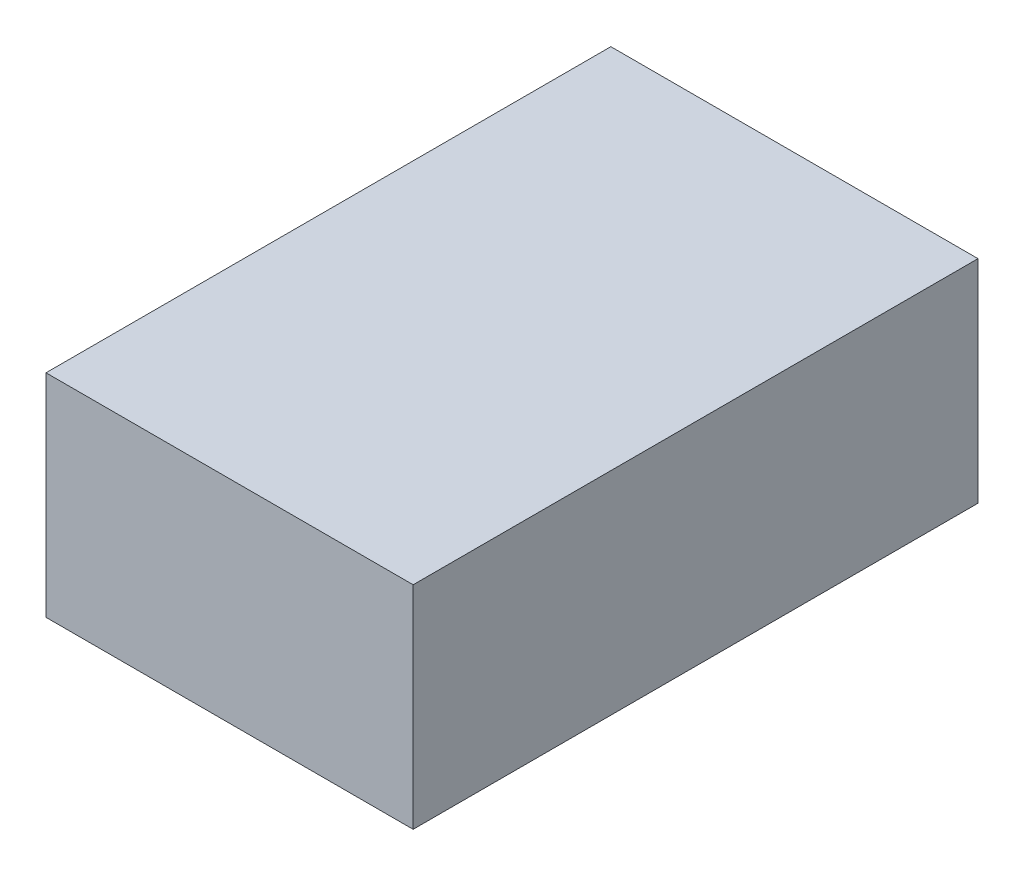
ISO-10303-21;
HEADER;
FILE_DESCRIPTION(('STEP AP214'),'2;1');
FILE_NAME('part.step','',(''),(''),'','','');
FILE_SCHEMA(('AUTOMOTIVE_DESIGN { 1 0 10303 214 1 1 1 1 }'));
ENDSEC;
DATA;
#1=APPLICATION_CONTEXT('core data for automotive mechanical design processes');
#2=APPLICATION_PROTOCOL_DEFINITION('international standard','automotive_design',2000,#1);
#3=PRODUCT_CONTEXT('',#1,'mechanical');
#4=PRODUCT('Part','Part','',(#3));
#5=PRODUCT_RELATED_PRODUCT_CATEGORY('part','',(#4));
#6=PRODUCT_DEFINITION_FORMATION('','',#4);
#7=PRODUCT_DEFINITION_CONTEXT('part definition',#1,'design');
#8=PRODUCT_DEFINITION('design','',#6,#7);
#9=PRODUCT_DEFINITION_SHAPE('','',#8);
#10=(LENGTH_UNIT() NAMED_UNIT(*) SI_UNIT(.MILLI.,.METRE.));
#11=(NAMED_UNIT(*) PLANE_ANGLE_UNIT() SI_UNIT($,.RADIAN.));
#12=(NAMED_UNIT(*) SI_UNIT($,.STERADIAN.) SOLID_ANGLE_UNIT());
#13=UNCERTAINTY_MEASURE_WITH_UNIT(LENGTH_MEASURE(1.E-05),#10,'distance_accuracy_value','');
#14=(GEOMETRIC_REPRESENTATION_CONTEXT(3) GLOBAL_UNCERTAINTY_ASSIGNED_CONTEXT((#13)) GLOBAL_UNIT_ASSIGNED_CONTEXT((#10,
#11,#12)) REPRESENTATION_CONTEXT('',''));
#15=CARTESIAN_POINT('',(0.,0.,0.));
#16=DIRECTION('',(0.,0.,1.));
#17=DIRECTION('',(1.,0.,0.));
#18=AXIS2_PLACEMENT_3D('',#15,#16,#17);
#19=CARTESIAN_POINT('',(-17.6981071180035,1.5,18.3416698766876));
#20=DIRECTION('',(1.,0.,0.));
#21=DIRECTION('',(0.,0.,-1.));
#22=AXIS2_PLACEMENT_3D('',#19,#20,#21);
#23=PLANE('',#22);
#24=DIRECTION('',(0.,0.,1.));
#25=VECTOR('',#24,1.);
#26=CARTESIAN_POINT('',(-17.6981071180035,0.,18.3416698766876));
#27=LINE('',#26,#25);
#28=CARTESIAN_POINT('',(-17.6981071180035,0.,18.3416698766876));
#29=VERTEX_POINT('',#28);
#30=CARTESIAN_POINT('',(-17.6981071180035,0.,22.3416698766876));
#31=VERTEX_POINT('',#30);
#32=EDGE_CURVE('E107',#29,#31,#27,.T.);
#33=ORIENTED_EDGE('',*,*,#32,.T.);
#34=DIRECTION('',(0.,-1.,0.));
#35=VECTOR('',#34,1.);
#36=CARTESIAN_POINT('',(-17.6981071180035,1.5,22.3416698766876));
#37=LINE('',#36,#35);
#38=CARTESIAN_POINT('',(-17.6981071180035,1.5,22.3416698766876));
#39=VERTEX_POINT('',#38);
#40=EDGE_CURVE('E11',#39,#31,#37,.T.);
#41=ORIENTED_EDGE('',*,*,#40,.F.);
#42=DIRECTION('',(0.,0.,1.));
#43=VECTOR('',#42,1.);
#44=CARTESIAN_POINT('',(-17.6981071180035,1.5,18.3416698766876));
#45=LINE('',#44,#43);
#46=CARTESIAN_POINT('',(-17.6981071180035,1.5,18.3416698766876));
#47=VERTEX_POINT('',#46);
#48=EDGE_CURVE('E91',#47,#39,#45,.T.);
#49=ORIENTED_EDGE('',*,*,#48,.F.);
#50=DIRECTION('',(0.,-1.,0.));
#51=VECTOR('',#50,1.);
#52=CARTESIAN_POINT('',(-17.6981071180035,1.5,18.3416698766876));
#53=LINE('',#52,#51);
#54=EDGE_CURVE('E103',#47,#29,#53,.T.);
#55=ORIENTED_EDGE('',*,*,#54,.T.);
#56=EDGE_LOOP('',(#33,#41,#49,#55));
#57=FACE_BOUND('',#56,.T.);
#58=ADVANCED_FACE('F39',(#57),#23,.F.);
#59=CARTESIAN_POINT('',(-17.6981071180035,1.5,22.3416698766876));
#60=DIRECTION('',(0.,0.,-1.));
#61=DIRECTION('',(-1.,0.,0.));
#62=AXIS2_PLACEMENT_3D('',#59,#60,#61);
#63=PLANE('',#62);
#64=DIRECTION('',(1.,0.,0.));
#65=VECTOR('',#64,1.);
#66=CARTESIAN_POINT('',(-17.6981071180035,0.,22.3416698766876));
#67=LINE('',#66,#65);
#68=CARTESIAN_POINT('',(-15.0981071180035,0.,22.3416698766876));
#69=VERTEX_POINT('',#68);
#70=EDGE_CURVE('E96',#31,#69,#67,.T.);
#71=ORIENTED_EDGE('',*,*,#70,.T.);
#72=DIRECTION('',(0.,-1.,0.));
#73=VECTOR('',#72,1.);
#74=CARTESIAN_POINT('',(-15.0981071180035,1.5,22.3416698766876));
#75=LINE('',#74,#73);
#76=CARTESIAN_POINT('',(-15.0981071180035,1.5,22.3416698766876));
#77=VERTEX_POINT('',#76);
#78=EDGE_CURVE('E48',#77,#69,#75,.T.);
#79=ORIENTED_EDGE('',*,*,#78,.F.);
#80=DIRECTION('',(1.,0.,0.));
#81=VECTOR('',#80,1.);
#82=CARTESIAN_POINT('',(-17.6981071180035,1.5,22.3416698766876));
#83=LINE('',#82,#81);
#84=EDGE_CURVE('E86',#39,#77,#83,.T.);
#85=ORIENTED_EDGE('',*,*,#84,.F.);
#86=ORIENTED_EDGE('',*,*,#40,.T.);
#87=EDGE_LOOP('',(#71,#79,#85,#86));
#88=FACE_BOUND('',#87,.T.);
#89=ADVANCED_FACE('F95',(#88),#63,.F.);
#90=CARTESIAN_POINT('',(-15.0981071180035,1.5,18.3416698766876));
#91=DIRECTION('',(-1.,0.,0.));
#92=DIRECTION('',(0.,0.,1.));
#93=AXIS2_PLACEMENT_3D('',#90,#91,#92);
#94=PLANE('',#93);
#95=DIRECTION('',(0.,0.,-1.));
#96=VECTOR('',#95,1.);
#97=CARTESIAN_POINT('',(-15.0981071180035,0.,18.3416698766876));
#98=LINE('',#97,#96);
#99=CARTESIAN_POINT('',(-15.0981071180035,0.,18.3416698766876));
#100=VERTEX_POINT('',#99);
#101=EDGE_CURVE('E73',#69,#100,#98,.T.);
#102=ORIENTED_EDGE('',*,*,#101,.T.);
#103=DIRECTION('',(0.,-1.,0.));
#104=VECTOR('',#103,1.);
#105=CARTESIAN_POINT('',(-15.0981071180035,1.5,18.3416698766876));
#106=LINE('',#105,#104);
#107=CARTESIAN_POINT('',(-15.0981071180035,1.5,18.3416698766876));
#108=VERTEX_POINT('',#107);
#109=EDGE_CURVE('E98',#108,#100,#106,.T.);
#110=ORIENTED_EDGE('',*,*,#109,.F.);
#111=DIRECTION('',(0.,0.,-1.));
#112=VECTOR('',#111,1.);
#113=CARTESIAN_POINT('',(-15.0981071180035,1.5,18.3416698766876));
#114=LINE('',#113,#112);
#115=EDGE_CURVE('E89',#77,#108,#114,.T.);
#116=ORIENTED_EDGE('',*,*,#115,.F.);
#117=ORIENTED_EDGE('',*,*,#78,.T.);
#118=EDGE_LOOP('',(#102,#110,#116,#117));
#119=FACE_BOUND('',#118,.T.);
#120=ADVANCED_FACE('F99',(#119),#94,.F.);
#121=CARTESIAN_POINT('',(-17.6981071180035,1.5,18.3416698766876));
#122=DIRECTION('',(0.,0.,1.));
#123=DIRECTION('',(1.,0.,0.));
#124=AXIS2_PLACEMENT_3D('',#121,#122,#123);
#125=PLANE('',#124);
#126=DIRECTION('',(-1.,0.,0.));
#127=VECTOR('',#126,1.);
#128=CARTESIAN_POINT('',(-17.6981071180035,0.,18.3416698766876));
#129=LINE('',#128,#127);
#130=EDGE_CURVE('E79',#100,#29,#129,.T.);
#131=ORIENTED_EDGE('',*,*,#130,.T.);
#132=ORIENTED_EDGE('',*,*,#54,.F.);
#133=DIRECTION('',(-1.,0.,0.));
#134=VECTOR('',#133,1.);
#135=CARTESIAN_POINT('',(-17.6981071180035,1.5,18.3416698766876));
#136=LINE('',#135,#134);
#137=EDGE_CURVE('E56',#108,#47,#136,.T.);
#138=ORIENTED_EDGE('',*,*,#137,.F.);
#139=ORIENTED_EDGE('',*,*,#109,.T.);
#140=EDGE_LOOP('',(#131,#132,#138,#139));
#141=FACE_BOUND('',#140,.T.);
#142=ADVANCED_FACE('F120',(#141),#125,.F.);
#143=CARTESIAN_POINT('',(0.,1.5,0.));
#144=DIRECTION('',(0.,1.,0.));
#145=DIRECTION('',(0.,0.,1.));
#146=AXIS2_PLACEMENT_3D('',#143,#144,#145);
#147=PLANE('',#146);
#148=ORIENTED_EDGE('',*,*,#48,.T.);
#149=ORIENTED_EDGE('',*,*,#84,.T.);
#150=ORIENTED_EDGE('',*,*,#115,.T.);
#151=ORIENTED_EDGE('',*,*,#137,.T.);
#152=EDGE_LOOP('',(#148,#149,#150,#151));
#153=FACE_BOUND('',#152,.T.);
#154=ADVANCED_FACE('F87',(#153),#147,.T.);
#155=CARTESIAN_POINT('',(0.,0.,0.));
#156=DIRECTION('',(0.,1.,0.));
#157=DIRECTION('',(0.,0.,1.));
#158=AXIS2_PLACEMENT_3D('',#155,#156,#157);
#159=PLANE('',#158);
#160=ORIENTED_EDGE('',*,*,#32,.F.);
#161=ORIENTED_EDGE('',*,*,#130,.F.);
#162=ORIENTED_EDGE('',*,*,#101,.F.);
#163=ORIENTED_EDGE('',*,*,#70,.F.);
#164=EDGE_LOOP('',(#160,#161,#162,#163));
#165=FACE_BOUND('',#164,.T.);
#166=ADVANCED_FACE('F123',(#165),#159,.F.);
#167=CLOSED_SHELL('',(#58,#89,#120,#142,#154,#166));
#168=MANIFOLD_SOLID_BREP('B2',#167);
#169=ADVANCED_BREP_SHAPE_REPRESENTATION('',(#18,#168),#14);
#170=SHAPE_DEFINITION_REPRESENTATION(#9,#169);
ENDSEC;
END-ISO-10303-21;
